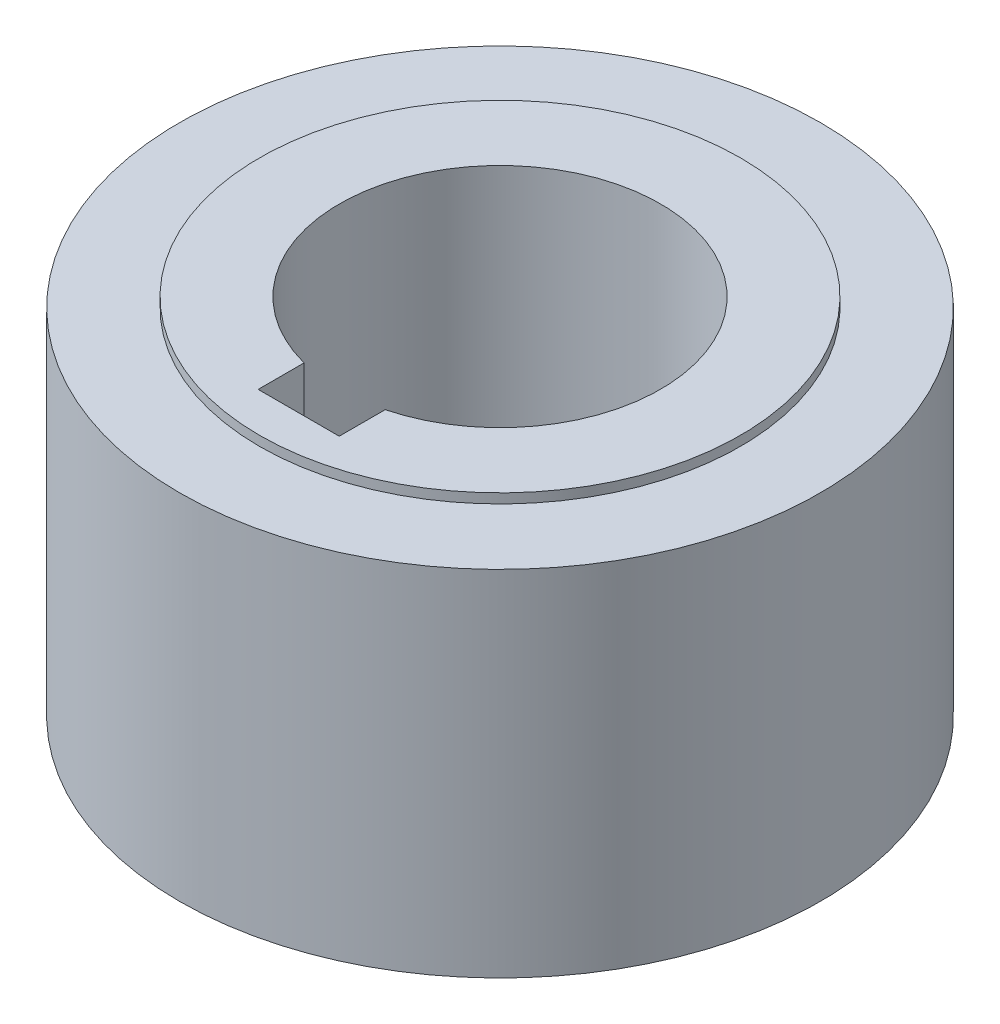
ISO-10303-21;
HEADER;
FILE_DESCRIPTION(('STEP AP214'),'2;1');
FILE_NAME('part.step','',(''),(''),'','','');
FILE_SCHEMA(('AUTOMOTIVE_DESIGN { 1 0 10303 214 1 1 1 1 }'));
ENDSEC;
DATA;
#1=APPLICATION_CONTEXT('core data for automotive mechanical design processes');
#2=APPLICATION_PROTOCOL_DEFINITION('international standard','automotive_design',2000,#1);
#3=PRODUCT_CONTEXT('',#1,'mechanical');
#4=PRODUCT('Part','Part','',(#3));
#5=PRODUCT_RELATED_PRODUCT_CATEGORY('part','',(#4));
#6=PRODUCT_DEFINITION_FORMATION('','',#4);
#7=PRODUCT_DEFINITION_CONTEXT('part definition',#1,'design');
#8=PRODUCT_DEFINITION('design','',#6,#7);
#9=PRODUCT_DEFINITION_SHAPE('','',#8);
#10=(LENGTH_UNIT() NAMED_UNIT(*) SI_UNIT(.MILLI.,.METRE.));
#11=(NAMED_UNIT(*) PLANE_ANGLE_UNIT() SI_UNIT($,.RADIAN.));
#12=(NAMED_UNIT(*) SI_UNIT($,.STERADIAN.) SOLID_ANGLE_UNIT());
#13=UNCERTAINTY_MEASURE_WITH_UNIT(LENGTH_MEASURE(1.E-05),#10,'distance_accuracy_value','');
#14=(GEOMETRIC_REPRESENTATION_CONTEXT(3) GLOBAL_UNCERTAINTY_ASSIGNED_CONTEXT((#13)) GLOBAL_UNIT_ASSIGNED_CONTEXT((#10,
#11,#12)) REPRESENTATION_CONTEXT('',''));
#15=CARTESIAN_POINT('',(0.,0.,0.));
#16=DIRECTION('',(0.,0.,1.));
#17=DIRECTION('',(1.,0.,0.));
#18=AXIS2_PLACEMENT_3D('',#15,#16,#17);
#19=CARTESIAN_POINT('',(-1.60655,24.0611335783594,7.97560000000001));
#20=DIRECTION('',(-1.,0.,0.));
#21=DIRECTION('',(0.,0.,1.));
#22=AXIS2_PLACEMENT_3D('',#19,#20,#21);
#23=PLANE('',#22);
#24=DIRECTION('',(0.,1.,0.));
#25=VECTOR('',#24,1.);
#26=CARTESIAN_POINT('',(-1.60655,24.0611335783594,7.97560000000001));
#27=LINE('',#26,#25);
#28=CARTESIAN_POINT('',(-1.60655,0.,7.97560000000001));
#29=VERTEX_POINT('',#28);
#30=CARTESIAN_POINT('',(-1.60655,-14.7828,7.97560000000001));
#31=VERTEX_POINT('',#30);
#32=EDGE_CURVE('E59',#29,#31,#27,.F.);
#33=ORIENTED_EDGE('',*,*,#32,.T.);
#34=DIRECTION('',(0.,0.,1.));
#35=VECTOR('',#34,1.);
#36=CARTESIAN_POINT('',(-1.60655,-14.7828,0.));
#37=LINE('',#36,#35);
#38=CARTESIAN_POINT('',(-1.60655,-14.7828,6.15653704508468));
#39=VERTEX_POINT('',#38);
#40=EDGE_CURVE('E54',#31,#39,#37,.F.);
#41=ORIENTED_EDGE('',*,*,#40,.T.);
#42=DIRECTION('',(0.,-1.,0.));
#43=VECTOR('',#42,1.);
#44=CARTESIAN_POINT('',(-1.60655,-14.7828,6.15653704508468));
#45=LINE('',#44,#43);
#46=CARTESIAN_POINT('',(-1.60655,0.,6.15653704508468));
#47=VERTEX_POINT('',#46);
#48=EDGE_CURVE('E56',#39,#47,#45,.F.);
#49=ORIENTED_EDGE('',*,*,#48,.T.);
#50=DIRECTION('',(0.,0.,1.));
#51=VECTOR('',#50,1.);
#52=CARTESIAN_POINT('',(-1.60655,0.,0.));
#53=LINE('',#52,#51);
#54=EDGE_CURVE('E78',#29,#47,#53,.F.);
#55=ORIENTED_EDGE('',*,*,#54,.F.);
#56=EDGE_LOOP('',(#33,#41,#49,#55));
#57=FACE_BOUND('',#56,.T.);
#58=ADVANCED_FACE('F17',(#57),#23,.F.);
#59=CARTESIAN_POINT('',(0.,-14.7828,0.));
#60=DIRECTION('',(0.,-1.,0.));
#61=DIRECTION('',(0.,0.,-1.));
#62=AXIS2_PLACEMENT_3D('',#59,#60,#61);
#63=CYLINDRICAL_SURFACE('',#62,6.3627);
#64=ORIENTED_EDGE('',*,*,#48,.F.);
#65=CARTESIAN_POINT('',(0.,-14.7828,0.));
#66=DIRECTION('',(0.,-1.,0.));
#67=DIRECTION('',(0.,0.,-1.));
#68=AXIS2_PLACEMENT_3D('',#65,#66,#67);
#69=CIRCLE('',#68,6.3627);
#70=CARTESIAN_POINT('',(1.60655,-14.7828,6.15653704508468));
#71=VERTEX_POINT('',#70);
#72=EDGE_CURVE('E20',#39,#71,#69,.T.);
#73=ORIENTED_EDGE('',*,*,#72,.T.);
#74=DIRECTION('',(0.,1.,0.));
#75=VECTOR('',#74,1.);
#76=CARTESIAN_POINT('',(1.60655,24.0611335783594,6.15653704508468));
#77=LINE('',#76,#75);
#78=CARTESIAN_POINT('',(1.60655,0.,6.15653704508468));
#79=VERTEX_POINT('',#78);
#80=EDGE_CURVE('E73',#71,#79,#77,.T.);
#81=ORIENTED_EDGE('',*,*,#80,.T.);
#82=CARTESIAN_POINT('',(0.,0.,0.));
#83=DIRECTION('',(0.,-1.,0.));
#84=DIRECTION('',(0.,0.,-1.));
#85=AXIS2_PLACEMENT_3D('',#82,#83,#84);
#86=CIRCLE('',#85,6.3627);
#87=EDGE_CURVE('E71',#47,#79,#86,.T.);
#88=ORIENTED_EDGE('',*,*,#87,.F.);
#89=EDGE_LOOP('',(#64,#73,#81,#88));
#90=FACE_BOUND('',#89,.T.);
#91=ADVANCED_FACE('F68',(#90),#63,.F.);
#92=CARTESIAN_POINT('',(1.60655,24.0611335783594,0.));
#93=DIRECTION('',(1.,0.,0.));
#94=DIRECTION('',(0.,0.,-1.));
#95=AXIS2_PLACEMENT_3D('',#92,#93,#94);
#96=PLANE('',#95);
#97=ORIENTED_EDGE('',*,*,#80,.F.);
#98=DIRECTION('',(0.,0.,1.));
#99=VECTOR('',#98,1.);
#100=CARTESIAN_POINT('',(1.60655,-14.7828,0.));
#101=LINE('',#100,#99);
#102=CARTESIAN_POINT('',(1.60655,-14.7828,7.97560000000001));
#103=VERTEX_POINT('',#102);
#104=EDGE_CURVE('E77',#71,#103,#101,.T.);
#105=ORIENTED_EDGE('',*,*,#104,.T.);
#106=DIRECTION('',(0.,1.,0.));
#107=VECTOR('',#106,1.);
#108=CARTESIAN_POINT('',(1.60655,24.0611335783594,7.97560000000001));
#109=LINE('',#108,#107);
#110=CARTESIAN_POINT('',(1.60655,0.,7.97560000000001));
#111=VERTEX_POINT('',#110);
#112=EDGE_CURVE('E35',#103,#111,#109,.T.);
#113=ORIENTED_EDGE('',*,*,#112,.T.);
#114=DIRECTION('',(0.,0.,1.));
#115=VECTOR('',#114,1.);
#116=CARTESIAN_POINT('',(1.60655,0.,0.));
#117=LINE('',#116,#115);
#118=EDGE_CURVE('E82',#79,#111,#117,.T.);
#119=ORIENTED_EDGE('',*,*,#118,.F.);
#120=EDGE_LOOP('',(#97,#105,#113,#119));
#121=FACE_BOUND('',#120,.T.);
#122=ADVANCED_FACE('F134',(#121),#96,.F.);
#123=CARTESIAN_POINT('',(1.60655,24.0611335783594,7.97560000000001));
#124=DIRECTION('',(0.,0.,1.));
#125=DIRECTION('',(1.,0.,0.));
#126=AXIS2_PLACEMENT_3D('',#123,#124,#125);
#127=PLANE('',#126);
#128=ORIENTED_EDGE('',*,*,#112,.F.);
#129=DIRECTION('',(1.,0.,0.));
#130=VECTOR('',#129,1.);
#131=CARTESIAN_POINT('',(0.,-14.7828,7.97560000000001));
#132=LINE('',#131,#130);
#133=EDGE_CURVE('E64',#103,#31,#132,.F.);
#134=ORIENTED_EDGE('',*,*,#133,.T.);
#135=ORIENTED_EDGE('',*,*,#32,.F.);
#136=DIRECTION('',(1.,0.,0.));
#137=VECTOR('',#136,1.);
#138=CARTESIAN_POINT('',(0.,0.,7.97560000000001));
#139=LINE('',#138,#137);
#140=EDGE_CURVE('E95',#111,#29,#139,.F.);
#141=ORIENTED_EDGE('',*,*,#140,.F.);
#142=EDGE_LOOP('',(#128,#134,#135,#141));
#143=FACE_BOUND('',#142,.T.);
#144=ADVANCED_FACE('F126',(#143),#127,.F.);
#145=CARTESIAN_POINT('',(0.,-14.7828,0.));
#146=DIRECTION('',(0.,1.,0.));
#147=DIRECTION('',(0.,0.,1.));
#148=AXIS2_PLACEMENT_3D('',#145,#146,#147);
#149=PLANE('',#148);
#150=ORIENTED_EDGE('',*,*,#40,.F.);
#151=ORIENTED_EDGE('',*,*,#133,.F.);
#152=ORIENTED_EDGE('',*,*,#104,.F.);
#153=ORIENTED_EDGE('',*,*,#72,.F.);
#154=EDGE_LOOP('',(#150,#151,#152,#153));
#155=FACE_BOUND('',#154,.T.);
#156=CARTESIAN_POINT('',(0.,-14.7828,0.));
#157=DIRECTION('',(0.,1.,0.));
#158=DIRECTION('',(0.,0.,1.));
#159=AXIS2_PLACEMENT_3D('',#156,#157,#158);
#160=CIRCLE('',#159,9.525);
#161=CARTESIAN_POINT('',(0.,-14.7828,9.525));
#162=VERTEX_POINT('',#161);
#163=EDGE_CURVE('E97',#162,#162,#160,.T.);
#164=ORIENTED_EDGE('',*,*,#163,.F.);
#165=EDGE_LOOP('',(#164));
#166=FACE_BOUND('',#165,.T.);
#167=ADVANCED_FACE('F75',(#155,#166),#149,.F.);
#168=CARTESIAN_POINT('',(0.,0.,0.));
#169=DIRECTION('',(0.,1.,0.));
#170=DIRECTION('',(0.,0.,1.));
#171=AXIS2_PLACEMENT_3D('',#168,#169,#170);
#172=PLANE('',#171);
#173=ORIENTED_EDGE('',*,*,#118,.T.);
#174=ORIENTED_EDGE('',*,*,#140,.T.);
#175=ORIENTED_EDGE('',*,*,#54,.T.);
#176=ORIENTED_EDGE('',*,*,#87,.T.);
#177=EDGE_LOOP('',(#173,#174,#175,#176));
#178=FACE_BOUND('',#177,.T.);
#179=CARTESIAN_POINT('',(0.,0.,0.));
#180=DIRECTION('',(0.,1.,0.));
#181=DIRECTION('',(0.,0.,1.));
#182=AXIS2_PLACEMENT_3D('',#179,#180,#181);
#183=CIRCLE('',#182,9.52499999999999);
#184=CARTESIAN_POINT('',(0.,0.,9.52499999999999));
#185=VERTEX_POINT('',#184);
#186=EDGE_CURVE('E117',#185,#185,#183,.F.);
#187=ORIENTED_EDGE('',*,*,#186,.F.);
#188=EDGE_LOOP('',(#187));
#189=FACE_BOUND('',#188,.T.);
#190=ADVANCED_FACE('F125',(#178,#189),#172,.T.);
#191=CARTESIAN_POINT('',(0.,-60.,0.));
#192=DIRECTION('',(0.,1.,0.));
#193=DIRECTION('',(0.,0.,1.));
#194=AXIS2_PLACEMENT_3D('',#191,#192,#193);
#195=CYLINDRICAL_SURFACE('',#194,9.525);
#196=CARTESIAN_POINT('',(0.,-14.4018,0.));
#197=DIRECTION('',(0.,1.,0.));
#198=DIRECTION('',(0.,0.,1.));
#199=AXIS2_PLACEMENT_3D('',#196,#197,#198);
#200=CIRCLE('',#199,9.525);
#201=CARTESIAN_POINT('',(0.,-14.4018,9.525));
#202=VERTEX_POINT('',#201);
#203=EDGE_CURVE('E114',#202,#202,#200,.F.);
#204=ORIENTED_EDGE('',*,*,#203,.T.);
#205=EDGE_LOOP('',(#204));
#206=FACE_BOUND('',#205,.T.);
#207=ORIENTED_EDGE('',*,*,#163,.T.);
#208=EDGE_LOOP('',(#207));
#209=FACE_BOUND('',#208,.T.);
#210=ADVANCED_FACE('F123',(#206,#209),#195,.T.);
#211=CARTESIAN_POINT('',(0.,-60.,0.));
#212=DIRECTION('',(0.,1.,0.));
#213=DIRECTION('',(0.,0.,1.));
#214=AXIS2_PLACEMENT_3D('',#211,#212,#213);
#215=CYLINDRICAL_SURFACE('',#214,9.52499999999999);
#216=ORIENTED_EDGE('',*,*,#186,.T.);
#217=EDGE_LOOP('',(#216));
#218=FACE_BOUND('',#217,.T.);
#219=CARTESIAN_POINT('',(0.,-0.380999999999999,0.));
#220=DIRECTION('',(0.,1.,0.));
#221=DIRECTION('',(0.,0.,1.));
#222=AXIS2_PLACEMENT_3D('',#219,#220,#221);
#223=CIRCLE('',#222,9.52499999999999);
#224=CARTESIAN_POINT('',(0.,-0.381,9.52499999999999));
#225=VERTEX_POINT('',#224);
#226=EDGE_CURVE('E111',#225,#225,#223,.T.);
#227=ORIENTED_EDGE('',*,*,#226,.T.);
#228=EDGE_LOOP('',(#227));
#229=FACE_BOUND('',#228,.T.);
#230=ADVANCED_FACE('F152',(#218,#229),#215,.T.);
#231=CARTESIAN_POINT('',(0.,-14.4018,14.8223881045635));
#232=DIRECTION('',(0.,1.,0.));
#233=DIRECTION('',(0.,0.,1.));
#234=AXIS2_PLACEMENT_3D('',#231,#232,#233);
#235=PLANE('',#234);
#236=CARTESIAN_POINT('',(0.,-14.4018,0.));
#237=DIRECTION('',(0.,-1.,0.));
#238=DIRECTION('',(0.,0.,-1.));
#239=AXIS2_PLACEMENT_3D('',#236,#237,#238);
#240=CIRCLE('',#239,12.7);
#241=CARTESIAN_POINT('',(0.,-14.4018,-12.7));
#242=VERTEX_POINT('',#241);
#243=EDGE_CURVE('E26',#242,#242,#240,.F.);
#244=ORIENTED_EDGE('',*,*,#243,.F.);
#245=EDGE_LOOP('',(#244));
#246=FACE_BOUND('',#245,.T.);
#247=ORIENTED_EDGE('',*,*,#203,.F.);
#248=EDGE_LOOP('',(#247));
#249=FACE_BOUND('',#248,.T.);
#250=ADVANCED_FACE('F145',(#246,#249),#235,.F.);
#251=CARTESIAN_POINT('',(0.,-0.381,9.52499999999999));
#252=DIRECTION('',(0.,-1.,0.));
#253=DIRECTION('',(0.,0.,-1.));
#254=AXIS2_PLACEMENT_3D('',#251,#252,#253);
#255=PLANE('',#254);
#256=ORIENTED_EDGE('',*,*,#226,.F.);
#257=EDGE_LOOP('',(#256));
#258=FACE_BOUND('',#257,.T.);
#259=CARTESIAN_POINT('',(0.,-0.380999999999999,0.));
#260=DIRECTION('',(0.,-1.,0.));
#261=DIRECTION('',(0.,0.,-1.));
#262=AXIS2_PLACEMENT_3D('',#259,#260,#261);
#263=CIRCLE('',#262,12.7);
#264=CARTESIAN_POINT('',(0.,-0.380999999999999,-12.7));
#265=VERTEX_POINT('',#264);
#266=EDGE_CURVE('E11',#265,#265,#263,.T.);
#267=ORIENTED_EDGE('',*,*,#266,.F.);
#268=EDGE_LOOP('',(#267));
#269=FACE_BOUND('',#268,.T.);
#270=ADVANCED_FACE('F139',(#258,#269),#255,.F.);
#271=CARTESIAN_POINT('',(0.,-14.7828,0.));
#272=DIRECTION('',(0.,-1.,0.));
#273=DIRECTION('',(0.,0.,-1.));
#274=AXIS2_PLACEMENT_3D('',#271,#272,#273);
#275=CYLINDRICAL_SURFACE('',#274,12.7);
#276=ORIENTED_EDGE('',*,*,#266,.T.);
#277=EDGE_LOOP('',(#276));
#278=FACE_BOUND('',#277,.T.);
#279=ORIENTED_EDGE('',*,*,#243,.T.);
#280=EDGE_LOOP('',(#279));
#281=FACE_BOUND('',#280,.T.);
#282=ADVANCED_FACE('F137',(#278,#281),#275,.T.);
#283=CLOSED_SHELL('',(#58,#91,#122,#144,#167,#190,#210,#230,#250,#270,#282));
#284=MANIFOLD_SOLID_BREP('B1',#283);
#285=ADVANCED_BREP_SHAPE_REPRESENTATION('',(#18,#284),#14);
#286=SHAPE_DEFINITION_REPRESENTATION(#9,#285);
ENDSEC;
END-ISO-10303-21;
